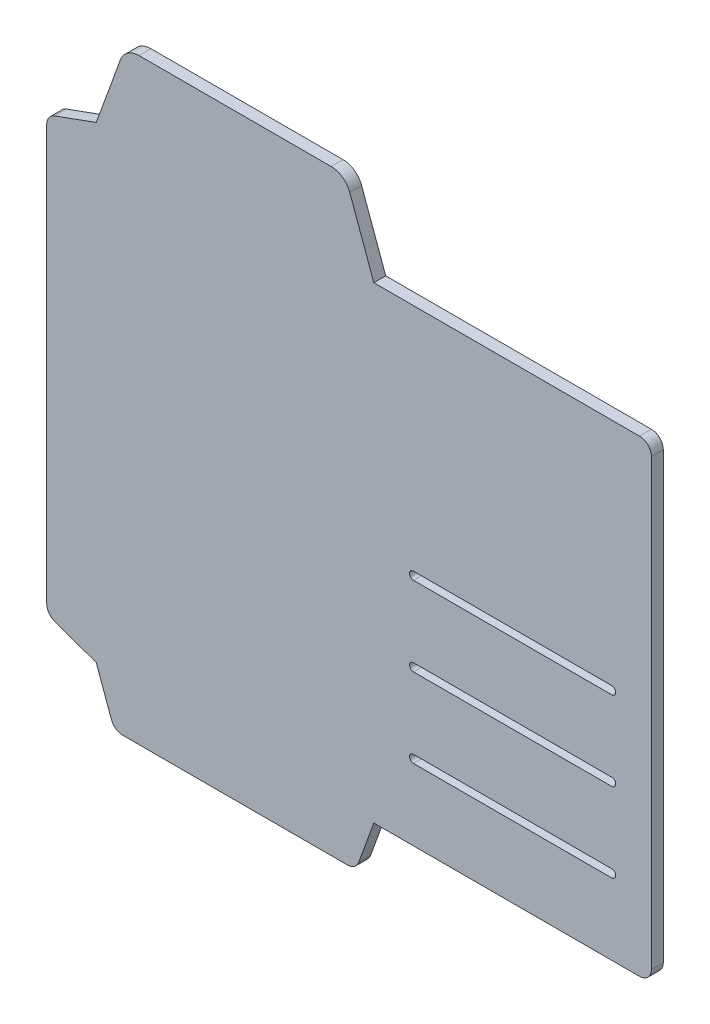
ISO-10303-21;
HEADER;
FILE_DESCRIPTION(('STEP AP214'),'2;1');
FILE_NAME('part.step','',(''),(''),'','','');
FILE_SCHEMA(('AUTOMOTIVE_DESIGN { 1 0 10303 214 1 1 1 1 }'));
ENDSEC;
DATA;
#1=APPLICATION_CONTEXT('core data for automotive mechanical design processes');
#2=APPLICATION_PROTOCOL_DEFINITION('international standard','automotive_design',2000,#1);
#3=PRODUCT_CONTEXT('',#1,'mechanical');
#4=PRODUCT('Part','Part','',(#3));
#5=PRODUCT_RELATED_PRODUCT_CATEGORY('part','',(#4));
#6=PRODUCT_DEFINITION_FORMATION('','',#4);
#7=PRODUCT_DEFINITION_CONTEXT('part definition',#1,'design');
#8=PRODUCT_DEFINITION('design','',#6,#7);
#9=PRODUCT_DEFINITION_SHAPE('','',#8);
#10=(LENGTH_UNIT() NAMED_UNIT(*) SI_UNIT(.MILLI.,.METRE.));
#11=(NAMED_UNIT(*) PLANE_ANGLE_UNIT() SI_UNIT($,.RADIAN.));
#12=(NAMED_UNIT(*) SI_UNIT($,.STERADIAN.) SOLID_ANGLE_UNIT());
#13=UNCERTAINTY_MEASURE_WITH_UNIT(LENGTH_MEASURE(1.E-05),#10,'distance_accuracy_value','');
#14=(GEOMETRIC_REPRESENTATION_CONTEXT(3) GLOBAL_UNCERTAINTY_ASSIGNED_CONTEXT((#13)) GLOBAL_UNIT_ASSIGNED_CONTEXT((#10,
#11,#12)) REPRESENTATION_CONTEXT('',''));
#15=CARTESIAN_POINT('',(0.,0.,0.));
#16=DIRECTION('',(0.,0.,1.));
#17=DIRECTION('',(1.,0.,0.));
#18=AXIS2_PLACEMENT_3D('',#15,#16,#17);
#19=CARTESIAN_POINT('',(0.,0.,3.));
#20=DIRECTION('',(0.,0.,-1.));
#21=DIRECTION('',(-1.,0.,0.));
#22=AXIS2_PLACEMENT_3D('',#19,#20,#21);
#23=PLANE('',#22);
#24=DIRECTION('',(1.,0.,0.));
#25=VECTOR('',#24,1.);
#26=CARTESIAN_POINT('',(80.,58.,3.));
#27=LINE('',#26,#25);
#28=CARTESIAN_POINT('',(80.,58.,3.));
#29=VERTEX_POINT('',#28);
#30=CARTESIAN_POINT('',(130.,58.,3.));
#31=VERTEX_POINT('',#30);
#32=EDGE_CURVE('E265',#29,#31,#27,.T.);
#33=ORIENTED_EDGE('',*,*,#32,.F.);
#34=CARTESIAN_POINT('',(80.,59.,3.));
#35=DIRECTION('',(0.,0.,1.));
#36=DIRECTION('',(1.,0.,0.));
#37=AXIS2_PLACEMENT_3D('',#34,#35,#36);
#38=CIRCLE('',#37,1.);
#39=CARTESIAN_POINT('',(80.,60.,3.));
#40=VERTEX_POINT('',#39);
#41=EDGE_CURVE('E41',#40,#29,#38,.T.);
#42=ORIENTED_EDGE('',*,*,#41,.F.);
#43=DIRECTION('',(-1.,0.,0.));
#44=VECTOR('',#43,1.);
#45=CARTESIAN_POINT('',(80.,60.,3.));
#46=LINE('',#45,#44);
#47=CARTESIAN_POINT('',(130.,60.,3.));
#48=VERTEX_POINT('',#47);
#49=EDGE_CURVE('E83',#48,#40,#46,.T.);
#50=ORIENTED_EDGE('',*,*,#49,.F.);
#51=CARTESIAN_POINT('',(130.,59.,3.));
#52=DIRECTION('',(0.,0.,1.));
#53=DIRECTION('',(1.,0.,0.));
#54=AXIS2_PLACEMENT_3D('',#51,#52,#53);
#55=CIRCLE('',#54,1.);
#56=EDGE_CURVE('E267',#31,#48,#55,.T.);
#57=ORIENTED_EDGE('',*,*,#56,.F.);
#58=EDGE_LOOP('',(#33,#42,#50,#57));
#59=FACE_BOUND('',#58,.T.);
#60=DIRECTION('',(1.,0.,0.));
#61=VECTOR('',#60,1.);
#62=CARTESIAN_POINT('',(80.0000000000002,38.,3.));
#63=LINE('',#62,#61);
#64=CARTESIAN_POINT('',(80.0000000000002,38.,3.));
#65=VERTEX_POINT('',#64);
#66=CARTESIAN_POINT('',(130.,38.,3.));
#67=VERTEX_POINT('',#66);
#68=EDGE_CURVE('E264',#65,#67,#63,.T.);
#69=ORIENTED_EDGE('',*,*,#68,.F.);
#70=CARTESIAN_POINT('',(80.0000000000002,39.,3.));
#71=DIRECTION('',(0.,0.,1.));
#72=DIRECTION('',(1.,0.,0.));
#73=AXIS2_PLACEMENT_3D('',#70,#71,#72);
#74=CIRCLE('',#73,1.);
#75=CARTESIAN_POINT('',(80.0000000000002,40.,3.));
#76=VERTEX_POINT('',#75);
#77=EDGE_CURVE('E253',#76,#65,#74,.T.);
#78=ORIENTED_EDGE('',*,*,#77,.F.);
#79=DIRECTION('',(-1.,0.,0.));
#80=VECTOR('',#79,1.);
#81=CARTESIAN_POINT('',(80.0000000000002,40.,3.));
#82=LINE('',#81,#80);
#83=CARTESIAN_POINT('',(130.,40.,3.));
#84=VERTEX_POINT('',#83);
#85=EDGE_CURVE('E243',#84,#76,#82,.T.);
#86=ORIENTED_EDGE('',*,*,#85,.F.);
#87=CARTESIAN_POINT('',(130.,39.,3.));
#88=DIRECTION('',(0.,0.,1.));
#89=DIRECTION('',(1.,0.,0.));
#90=AXIS2_PLACEMENT_3D('',#87,#88,#89);
#91=CIRCLE('',#90,1.);
#92=EDGE_CURVE('E237',#67,#84,#91,.T.);
#93=ORIENTED_EDGE('',*,*,#92,.F.);
#94=EDGE_LOOP('',(#69,#78,#86,#93));
#95=FACE_BOUND('',#94,.T.);
#96=DIRECTION('',(1.,0.,0.));
#97=VECTOR('',#96,1.);
#98=CARTESIAN_POINT('',(80.0000000000004,18.,3.));
#99=LINE('',#98,#97);
#100=CARTESIAN_POINT('',(80.0000000000004,18.,3.));
#101=VERTEX_POINT('',#100);
#102=CARTESIAN_POINT('',(130.,18.,3.));
#103=VERTEX_POINT('',#102);
#104=EDGE_CURVE('E418',#101,#103,#99,.T.);
#105=ORIENTED_EDGE('',*,*,#104,.F.);
#106=CARTESIAN_POINT('',(80.0000000000004,19.,3.));
#107=DIRECTION('',(0.,0.,1.));
#108=DIRECTION('',(1.,0.,0.));
#109=AXIS2_PLACEMENT_3D('',#106,#107,#108);
#110=CIRCLE('',#109,1.);
#111=CARTESIAN_POINT('',(80.0000000000004,20.,3.));
#112=VERTEX_POINT('',#111);
#113=EDGE_CURVE('E425',#112,#101,#110,.T.);
#114=ORIENTED_EDGE('',*,*,#113,.F.);
#115=DIRECTION('',(-1.,0.,0.));
#116=VECTOR('',#115,1.);
#117=CARTESIAN_POINT('',(80.0000000000004,20.,3.));
#118=LINE('',#117,#116);
#119=CARTESIAN_POINT('',(130.,20.,3.));
#120=VERTEX_POINT('',#119);
#121=EDGE_CURVE('E423',#120,#112,#118,.T.);
#122=ORIENTED_EDGE('',*,*,#121,.F.);
#123=CARTESIAN_POINT('',(130.,19.,3.));
#124=DIRECTION('',(0.,0.,1.));
#125=DIRECTION('',(1.,0.,0.));
#126=AXIS2_PLACEMENT_3D('',#123,#124,#125);
#127=CIRCLE('',#126,1.);
#128=EDGE_CURVE('E420',#103,#120,#127,.T.);
#129=ORIENTED_EDGE('',*,*,#128,.F.);
#130=EDGE_LOOP('',(#105,#114,#122,#129));
#131=FACE_BOUND('',#130,.T.);
#132=DIRECTION('',(1.,0.,0.));
#133=VECTOR('',#132,1.);
#134=CARTESIAN_POINT('',(70.,0.,3.));
#135=LINE('',#134,#133);
#136=CARTESIAN_POINT('',(70.,0.,3.));
#137=VERTEX_POINT('',#136);
#138=CARTESIAN_POINT('',(137.,0.,3.));
#139=VERTEX_POINT('',#138);
#140=EDGE_CURVE('E271',#137,#139,#135,.T.);
#141=ORIENTED_EDGE('',*,*,#140,.T.);
#142=CARTESIAN_POINT('',(137.,3.,3.));
#143=DIRECTION('',(0.,0.,-1.));
#144=DIRECTION('',(-1.,0.,0.));
#145=AXIS2_PLACEMENT_3D('',#142,#143,#144);
#146=CIRCLE('',#145,3.);
#147=CARTESIAN_POINT('',(140.,3.,3.));
#148=VERTEX_POINT('',#147);
#149=EDGE_CURVE('E408',#139,#148,#146,.F.);
#150=ORIENTED_EDGE('',*,*,#149,.T.);
#151=DIRECTION('',(0.,1.,0.));
#152=VECTOR('',#151,1.);
#153=CARTESIAN_POINT('',(140.,0.,3.));
#154=LINE('',#153,#152);
#155=CARTESIAN_POINT('',(140.,115.,3.));
#156=VERTEX_POINT('',#155);
#157=EDGE_CURVE('E276',#148,#156,#154,.T.);
#158=ORIENTED_EDGE('',*,*,#157,.T.);
#159=CARTESIAN_POINT('',(137.,115.,3.));
#160=DIRECTION('',(0.,0.,-1.));
#161=DIRECTION('',(-1.,0.,0.));
#162=AXIS2_PLACEMENT_3D('',#159,#160,#161);
#163=CIRCLE('',#162,3.);
#164=CARTESIAN_POINT('',(137.,118.,3.));
#165=VERTEX_POINT('',#164);
#166=EDGE_CURVE('E406',#156,#165,#163,.F.);
#167=ORIENTED_EDGE('',*,*,#166,.T.);
#168=DIRECTION('',(-1.,0.,0.));
#169=VECTOR('',#168,1.);
#170=CARTESIAN_POINT('',(70.,118.,3.));
#171=LINE('',#170,#169);
#172=CARTESIAN_POINT('',(70.,118.,3.));
#173=VERTEX_POINT('',#172);
#174=EDGE_CURVE('E281',#165,#173,#171,.T.);
#175=ORIENTED_EDGE('',*,*,#174,.T.);
#176=DIRECTION('',(-0.342020143325666,0.939692620785909,0.));
#177=VECTOR('',#176,1.);
#178=CARTESIAN_POINT('',(99.7360244806699,36.3009441950088,3.));
#179=LINE('',#178,#177);
#180=CARTESIAN_POINT('',(63.918020727557,134.710100716628,3.));
#181=VERTEX_POINT('',#180);
#182=EDGE_CURVE('E334',#173,#181,#179,.T.);
#183=ORIENTED_EDGE('',*,*,#182,.T.);
#184=CARTESIAN_POINT('',(59.2195576236275,133.,3.));
#185=DIRECTION('',(0.,0.,-1.));
#186=DIRECTION('',(-1.,0.,0.));
#187=AXIS2_PLACEMENT_3D('',#184,#185,#186);
#188=CIRCLE('',#187,5.);
#189=CARTESIAN_POINT('',(59.2195576236275,138.,3.));
#190=VERTEX_POINT('',#189);
#191=EDGE_CURVE('E390',#181,#190,#188,.F.);
#192=ORIENTED_EDGE('',*,*,#191,.T.);
#193=DIRECTION('',(-1.,0.,0.));
#194=VECTOR('',#193,1.);
#195=CARTESIAN_POINT('',(0.,138.,3.));
#196=LINE('',#195,#194);
#197=CARTESIAN_POINT('',(10.7804423763725,138.,3.));
#198=VERTEX_POINT('',#197);
#199=EDGE_CURVE('E325',#190,#198,#196,.T.);
#200=ORIENTED_EDGE('',*,*,#199,.T.);
#201=CARTESIAN_POINT('',(10.7804423763725,133.,3.));
#202=DIRECTION('',(0.,0.,-1.));
#203=DIRECTION('',(-1.,0.,0.));
#204=AXIS2_PLACEMENT_3D('',#201,#202,#203);
#205=CIRCLE('',#204,5.);
#206=CARTESIAN_POINT('',(6.081979272443,134.710100716628,3.));
#207=VERTEX_POINT('',#206);
#208=EDGE_CURVE('E392',#198,#207,#205,.F.);
#209=ORIENTED_EDGE('',*,*,#208,.T.);
#210=DIRECTION('',(0.342020143325666,0.939692620785909,0.));
#211=VECTOR('',#210,1.);
#212=CARTESIAN_POINT('',(-37.9244689715056,13.8033778559801,3.));
#213=LINE('',#212,#211);
#214=CARTESIAN_POINT('',(0.,118.,3.));
#215=VERTEX_POINT('',#214);
#216=EDGE_CURVE('E312',#215,#207,#213,.T.);
#217=ORIENTED_EDGE('',*,*,#216,.F.);
#218=DIRECTION('',(-0.939692620785907,-0.342020143325673,0.));
#219=VECTOR('',#218,1.);
#220=CARTESIAN_POINT('',(-37.9244689715062,104.196622144019,3.));
#221=LINE('',#220,#219);
#222=CARTESIAN_POINT('',(-10.526060429977,114.168827319401,3.));
#223=VERTEX_POINT('',#222);
#224=EDGE_CURVE('E309',#215,#223,#221,.T.);
#225=ORIENTED_EDGE('',*,*,#224,.T.);
#226=CARTESIAN_POINT('',(-9.49999999999998,111.349749457043,3.));
#227=DIRECTION('',(0.,0.,-1.));
#228=DIRECTION('',(-1.,0.,0.));
#229=AXIS2_PLACEMENT_3D('',#226,#227,#228);
#230=CIRCLE('',#229,3.);
#231=CARTESIAN_POINT('',(-12.5,111.349749457043,3.));
#232=VERTEX_POINT('',#231);
#233=EDGE_CURVE('E354',#223,#232,#230,.F.);
#234=ORIENTED_EDGE('',*,*,#233,.T.);
#235=DIRECTION('',(0.,1.,0.));
#236=VECTOR('',#235,1.);
#237=CARTESIAN_POINT('',(-12.5,0.,3.));
#238=LINE('',#237,#236);
#239=CARTESIAN_POINT('',(-12.5,6.6502505429567,3.));
#240=VERTEX_POINT('',#239);
#241=EDGE_CURVE('E305',#240,#232,#238,.T.);
#242=ORIENTED_EDGE('',*,*,#241,.F.);
#243=CARTESIAN_POINT('',(-9.49999999999998,6.6502505429567,3.));
#244=DIRECTION('',(0.,0.,-1.));
#245=DIRECTION('',(-1.,0.,0.));
#246=AXIS2_PLACEMENT_3D('',#243,#244,#245);
#247=CIRCLE('',#246,3.);
#248=CARTESIAN_POINT('',(-10.526060429977,3.83117268059898,3.));
#249=VERTEX_POINT('',#248);
#250=EDGE_CURVE('E356',#240,#249,#247,.F.);
#251=ORIENTED_EDGE('',*,*,#250,.T.);
#252=DIRECTION('',(-0.939692620785907,0.342020143325672,0.));
#253=VECTOR('',#252,1.);
#254=CARTESIAN_POINT('',(0.,0.,3.));
#255=LINE('',#254,#253);
#256=CARTESIAN_POINT('',(0.,0.,3.));
#257=VERTEX_POINT('',#256);
#258=EDGE_CURVE('E294',#257,#249,#255,.T.);
#259=ORIENTED_EDGE('',*,*,#258,.F.);
#260=DIRECTION('',(-0.342020143325673,0.939692620785907,0.));
#261=VECTOR('',#260,1.);
#262=CARTESIAN_POINT('',(0.,0.,3.));
#263=LINE('',#262,#261);
#264=CARTESIAN_POINT('',(3.83117268059899,-10.526060429977,3.));
#265=VERTEX_POINT('',#264);
#266=EDGE_CURVE('E289',#265,#257,#263,.T.);
#267=ORIENTED_EDGE('',*,*,#266,.F.);
#268=CARTESIAN_POINT('',(6.65025054295671,-9.49999999999999,3.));
#269=DIRECTION('',(0.,0.,-1.));
#270=DIRECTION('',(-1.,0.,0.));
#271=AXIS2_PLACEMENT_3D('',#268,#269,#270);
#272=CIRCLE('',#271,3.);
#273=CARTESIAN_POINT('',(6.65025054295671,-12.5,3.));
#274=VERTEX_POINT('',#273);
#275=EDGE_CURVE('E372',#265,#274,#272,.F.);
#276=ORIENTED_EDGE('',*,*,#275,.T.);
#277=DIRECTION('',(-1.,0.,0.));
#278=VECTOR('',#277,1.);
#279=CARTESIAN_POINT('',(0.,-12.5,3.));
#280=LINE('',#279,#278);
#281=CARTESIAN_POINT('',(63.3497494570433,-12.5,3.));
#282=VERTEX_POINT('',#281);
#283=EDGE_CURVE('E291',#282,#274,#280,.T.);
#284=ORIENTED_EDGE('',*,*,#283,.F.);
#285=CARTESIAN_POINT('',(63.3497494570433,-9.49999999999999,3.));
#286=DIRECTION('',(0.,0.,-1.));
#287=DIRECTION('',(-1.,0.,0.));
#288=AXIS2_PLACEMENT_3D('',#285,#286,#287);
#289=CIRCLE('',#288,3.);
#290=CARTESIAN_POINT('',(66.168827319401,-10.526060429977,3.));
#291=VERTEX_POINT('',#290);
#292=EDGE_CURVE('E374',#282,#291,#289,.F.);
#293=ORIENTED_EDGE('',*,*,#292,.T.);
#294=DIRECTION('',(0.342020143325671,0.939692620785908,0.));
#295=VECTOR('',#294,1.);
#296=CARTESIAN_POINT('',(61.8115555091641,-22.497566339029,3.));
#297=LINE('',#296,#295);
#298=EDGE_CURVE('E292',#291,#137,#297,.T.);
#299=ORIENTED_EDGE('',*,*,#298,.T.);
#300=EDGE_LOOP('',(#141,#150,#158,#167,#175,#183,#192,#200,#209,#217,#225,#234,#242,#251,#259,
#267,#276,#284,#293,#299));
#301=FACE_BOUND('',#300,.T.);
#302=ADVANCED_FACE('F37',(#59,#95,#131,#301),#23,.F.);
#303=CARTESIAN_POINT('',(0.,0.,0.));
#304=DIRECTION('',(0.,0.,-1.));
#305=DIRECTION('',(-1.,0.,0.));
#306=AXIS2_PLACEMENT_3D('',#303,#304,#305);
#307=PLANE('',#306);
#308=CARTESIAN_POINT('',(80.,59.,0.));
#309=DIRECTION('',(0.,0.,1.));
#310=DIRECTION('',(1.,0.,0.));
#311=AXIS2_PLACEMENT_3D('',#308,#309,#310);
#312=CIRCLE('',#311,1.);
#313=CARTESIAN_POINT('',(80.,60.,0.));
#314=VERTEX_POINT('',#313);
#315=CARTESIAN_POINT('',(80.,58.,0.));
#316=VERTEX_POINT('',#315);
#317=EDGE_CURVE('E261',#314,#316,#312,.T.);
#318=ORIENTED_EDGE('',*,*,#317,.T.);
#319=DIRECTION('',(1.,0.,0.));
#320=VECTOR('',#319,1.);
#321=CARTESIAN_POINT('',(80.,58.,0.));
#322=LINE('',#321,#320);
#323=CARTESIAN_POINT('',(130.,58.,0.));
#324=VERTEX_POINT('',#323);
#325=EDGE_CURVE('E793',#316,#324,#322,.T.);
#326=ORIENTED_EDGE('',*,*,#325,.T.);
#327=CARTESIAN_POINT('',(130.,59.,0.));
#328=DIRECTION('',(0.,0.,1.));
#329=DIRECTION('',(1.,0.,0.));
#330=AXIS2_PLACEMENT_3D('',#327,#328,#329);
#331=CIRCLE('',#330,1.);
#332=CARTESIAN_POINT('',(130.,60.,0.));
#333=VERTEX_POINT('',#332);
#334=EDGE_CURVE('E802',#324,#333,#331,.T.);
#335=ORIENTED_EDGE('',*,*,#334,.T.);
#336=DIRECTION('',(-1.,0.,0.));
#337=VECTOR('',#336,1.);
#338=CARTESIAN_POINT('',(80.,60.,0.));
#339=LINE('',#338,#337);
#340=EDGE_CURVE('E805',#333,#314,#339,.T.);
#341=ORIENTED_EDGE('',*,*,#340,.T.);
#342=EDGE_LOOP('',(#318,#326,#335,#341));
#343=FACE_BOUND('',#342,.T.);
#344=CARTESIAN_POINT('',(80.0000000000002,39.,0.));
#345=DIRECTION('',(0.,0.,1.));
#346=DIRECTION('',(1.,0.,0.));
#347=AXIS2_PLACEMENT_3D('',#344,#345,#346);
#348=CIRCLE('',#347,1.);
#349=CARTESIAN_POINT('',(80.0000000000002,40.,0.));
#350=VERTEX_POINT('',#349);
#351=CARTESIAN_POINT('',(80.0000000000002,38.,0.));
#352=VERTEX_POINT('',#351);
#353=EDGE_CURVE('E259',#350,#352,#348,.T.);
#354=ORIENTED_EDGE('',*,*,#353,.T.);
#355=DIRECTION('',(1.,0.,0.));
#356=VECTOR('',#355,1.);
#357=CARTESIAN_POINT('',(80.0000000000002,38.,0.));
#358=LINE('',#357,#356);
#359=CARTESIAN_POINT('',(130.,38.,0.));
#360=VERTEX_POINT('',#359);
#361=EDGE_CURVE('E814',#352,#360,#358,.T.);
#362=ORIENTED_EDGE('',*,*,#361,.T.);
#363=CARTESIAN_POINT('',(130.,39.,0.));
#364=DIRECTION('',(0.,0.,1.));
#365=DIRECTION('',(1.,0.,0.));
#366=AXIS2_PLACEMENT_3D('',#363,#364,#365);
#367=CIRCLE('',#366,1.);
#368=CARTESIAN_POINT('',(130.,40.,0.));
#369=VERTEX_POINT('',#368);
#370=EDGE_CURVE('E434',#360,#369,#367,.T.);
#371=ORIENTED_EDGE('',*,*,#370,.T.);
#372=DIRECTION('',(-1.,0.,0.));
#373=VECTOR('',#372,1.);
#374=CARTESIAN_POINT('',(80.0000000000002,40.,0.));
#375=LINE('',#374,#373);
#376=EDGE_CURVE('E437',#369,#350,#375,.T.);
#377=ORIENTED_EDGE('',*,*,#376,.T.);
#378=EDGE_LOOP('',(#354,#362,#371,#377));
#379=FACE_BOUND('',#378,.T.);
#380=CARTESIAN_POINT('',(80.0000000000004,19.,0.));
#381=DIRECTION('',(0.,0.,1.));
#382=DIRECTION('',(1.,0.,0.));
#383=AXIS2_PLACEMENT_3D('',#380,#381,#382);
#384=CIRCLE('',#383,1.);
#385=CARTESIAN_POINT('',(80.0000000000004,20.,0.));
#386=VERTEX_POINT('',#385);
#387=CARTESIAN_POINT('',(80.0000000000004,18.,0.));
#388=VERTEX_POINT('',#387);
#389=EDGE_CURVE('E440',#386,#388,#384,.T.);
#390=ORIENTED_EDGE('',*,*,#389,.T.);
#391=DIRECTION('',(1.,0.,0.));
#392=VECTOR('',#391,1.);
#393=CARTESIAN_POINT('',(80.0000000000004,18.,0.));
#394=LINE('',#393,#392);
#395=CARTESIAN_POINT('',(130.,18.,0.));
#396=VERTEX_POINT('',#395);
#397=EDGE_CURVE('E443',#388,#396,#394,.T.);
#398=ORIENTED_EDGE('',*,*,#397,.T.);
#399=CARTESIAN_POINT('',(130.,19.,0.));
#400=DIRECTION('',(0.,0.,1.));
#401=DIRECTION('',(1.,0.,0.));
#402=AXIS2_PLACEMENT_3D('',#399,#400,#401);
#403=CIRCLE('',#402,1.);
#404=CARTESIAN_POINT('',(130.,20.,0.));
#405=VERTEX_POINT('',#404);
#406=EDGE_CURVE('E446',#396,#405,#403,.T.);
#407=ORIENTED_EDGE('',*,*,#406,.T.);
#408=DIRECTION('',(-1.,0.,0.));
#409=VECTOR('',#408,1.);
#410=CARTESIAN_POINT('',(80.0000000000004,20.,0.));
#411=LINE('',#410,#409);
#412=EDGE_CURVE('E449',#405,#386,#411,.T.);
#413=ORIENTED_EDGE('',*,*,#412,.T.);
#414=EDGE_LOOP('',(#390,#398,#407,#413));
#415=FACE_BOUND('',#414,.T.);
#416=DIRECTION('',(0.,1.,0.));
#417=VECTOR('',#416,1.);
#418=CARTESIAN_POINT('',(140.,0.,0.));
#419=LINE('',#418,#417);
#420=CARTESIAN_POINT('',(140.,3.,0.));
#421=VERTEX_POINT('',#420);
#422=CARTESIAN_POINT('',(140.,115.,0.));
#423=VERTEX_POINT('',#422);
#424=EDGE_CURVE('E464',#421,#423,#419,.T.);
#425=ORIENTED_EDGE('',*,*,#424,.F.);
#426=CARTESIAN_POINT('',(137.,3.,0.));
#427=DIRECTION('',(0.,0.,-1.));
#428=DIRECTION('',(-1.,0.,0.));
#429=AXIS2_PLACEMENT_3D('',#426,#427,#428);
#430=CIRCLE('',#429,3.);
#431=CARTESIAN_POINT('',(137.,0.,0.));
#432=VERTEX_POINT('',#431);
#433=EDGE_CURVE('E46',#421,#432,#430,.T.);
#434=ORIENTED_EDGE('',*,*,#433,.T.);
#435=DIRECTION('',(1.,0.,0.));
#436=VECTOR('',#435,1.);
#437=CARTESIAN_POINT('',(70.,0.,0.));
#438=LINE('',#437,#436);
#439=CARTESIAN_POINT('',(70.,0.,0.));
#440=VERTEX_POINT('',#439);
#441=EDGE_CURVE('E288',#440,#432,#438,.T.);
#442=ORIENTED_EDGE('',*,*,#441,.F.);
#443=DIRECTION('',(0.342020143325671,0.939692620785908,0.));
#444=VECTOR('',#443,1.);
#445=CARTESIAN_POINT('',(61.8115555091641,-22.497566339029,0.));
#446=LINE('',#445,#444);
#447=CARTESIAN_POINT('',(66.168827319401,-10.526060429977,0.));
#448=VERTEX_POINT('',#447);
#449=EDGE_CURVE('E92',#448,#440,#446,.T.);
#450=ORIENTED_EDGE('',*,*,#449,.F.);
#451=CARTESIAN_POINT('',(63.3497494570433,-9.49999999999999,0.));
#452=DIRECTION('',(0.,0.,-1.));
#453=DIRECTION('',(-1.,0.,0.));
#454=AXIS2_PLACEMENT_3D('',#451,#452,#453);
#455=CIRCLE('',#454,3.);
#456=CARTESIAN_POINT('',(63.3497494570433,-12.5,0.));
#457=VERTEX_POINT('',#456);
#458=EDGE_CURVE('E380',#448,#457,#455,.T.);
#459=ORIENTED_EDGE('',*,*,#458,.T.);
#460=DIRECTION('',(-1.,0.,0.));
#461=VECTOR('',#460,1.);
#462=CARTESIAN_POINT('',(0.,-12.5,0.));
#463=LINE('',#462,#461);
#464=CARTESIAN_POINT('',(6.65025054295671,-12.5,0.));
#465=VERTEX_POINT('',#464);
#466=EDGE_CURVE('E299',#457,#465,#463,.T.);
#467=ORIENTED_EDGE('',*,*,#466,.T.);
#468=CARTESIAN_POINT('',(6.65025054295671,-9.49999999999999,0.));
#469=DIRECTION('',(0.,0.,-1.));
#470=DIRECTION('',(-1.,0.,0.));
#471=AXIS2_PLACEMENT_3D('',#468,#469,#470);
#472=CIRCLE('',#471,3.);
#473=CARTESIAN_POINT('',(3.83117268059899,-10.526060429977,0.));
#474=VERTEX_POINT('',#473);
#475=EDGE_CURVE('E378',#465,#474,#472,.T.);
#476=ORIENTED_EDGE('',*,*,#475,.T.);
#477=DIRECTION('',(-0.342020143325673,0.939692620785907,0.));
#478=VECTOR('',#477,1.);
#479=CARTESIAN_POINT('',(0.,0.,0.));
#480=LINE('',#479,#478);
#481=CARTESIAN_POINT('',(0.,0.,0.));
#482=VERTEX_POINT('',#481);
#483=EDGE_CURVE('E295',#474,#482,#480,.T.);
#484=ORIENTED_EDGE('',*,*,#483,.T.);
#485=DIRECTION('',(-0.939692620785907,0.342020143325672,0.));
#486=VECTOR('',#485,1.);
#487=CARTESIAN_POINT('',(0.,0.,0.));
#488=LINE('',#487,#486);
#489=CARTESIAN_POINT('',(-10.526060429977,3.83117268059898,0.));
#490=VERTEX_POINT('',#489);
#491=EDGE_CURVE('E314',#482,#490,#488,.T.);
#492=ORIENTED_EDGE('',*,*,#491,.T.);
#493=CARTESIAN_POINT('',(-9.49999999999998,6.6502505429567,0.));
#494=DIRECTION('',(0.,0.,-1.));
#495=DIRECTION('',(-1.,0.,0.));
#496=AXIS2_PLACEMENT_3D('',#493,#494,#495);
#497=CIRCLE('',#496,3.);
#498=CARTESIAN_POINT('',(-12.5,6.6502505429567,0.));
#499=VERTEX_POINT('',#498);
#500=EDGE_CURVE('E362',#490,#499,#497,.T.);
#501=ORIENTED_EDGE('',*,*,#500,.T.);
#502=DIRECTION('',(0.,1.,0.));
#503=VECTOR('',#502,1.);
#504=CARTESIAN_POINT('',(-12.5,0.,0.));
#505=LINE('',#504,#503);
#506=CARTESIAN_POINT('',(-12.5,111.349749457043,0.));
#507=VERTEX_POINT('',#506);
#508=EDGE_CURVE('E313',#499,#507,#505,.T.);
#509=ORIENTED_EDGE('',*,*,#508,.T.);
#510=CARTESIAN_POINT('',(-9.49999999999998,111.349749457043,0.));
#511=DIRECTION('',(0.,0.,-1.));
#512=DIRECTION('',(-1.,0.,0.));
#513=AXIS2_PLACEMENT_3D('',#510,#511,#512);
#514=CIRCLE('',#513,3.);
#515=CARTESIAN_POINT('',(-10.526060429977,114.168827319401,0.));
#516=VERTEX_POINT('',#515);
#517=EDGE_CURVE('E360',#507,#516,#514,.T.);
#518=ORIENTED_EDGE('',*,*,#517,.T.);
#519=DIRECTION('',(-0.939692620785907,-0.342020143325673,0.));
#520=VECTOR('',#519,1.);
#521=CARTESIAN_POINT('',(-37.9244689715062,104.196622144019,0.));
#522=LINE('',#521,#520);
#523=CARTESIAN_POINT('',(0.,118.,0.));
#524=VERTEX_POINT('',#523);
#525=EDGE_CURVE('E308',#524,#516,#522,.T.);
#526=ORIENTED_EDGE('',*,*,#525,.F.);
#527=DIRECTION('',(0.342020143325666,0.939692620785909,0.));
#528=VECTOR('',#527,1.);
#529=CARTESIAN_POINT('',(-37.9244689715056,13.8033778559801,0.));
#530=LINE('',#529,#528);
#531=CARTESIAN_POINT('',(6.081979272443,134.710100716628,0.));
#532=VERTEX_POINT('',#531);
#533=EDGE_CURVE('E321',#524,#532,#530,.T.);
#534=ORIENTED_EDGE('',*,*,#533,.T.);
#535=CARTESIAN_POINT('',(10.7804423763725,133.,0.));
#536=DIRECTION('',(0.,0.,-1.));
#537=DIRECTION('',(-1.,0.,0.));
#538=AXIS2_PLACEMENT_3D('',#535,#536,#537);
#539=CIRCLE('',#538,5.);
#540=CARTESIAN_POINT('',(10.7804423763725,138.,0.));
#541=VERTEX_POINT('',#540);
#542=EDGE_CURVE('E398',#532,#541,#539,.T.);
#543=ORIENTED_EDGE('',*,*,#542,.T.);
#544=DIRECTION('',(-1.,0.,0.));
#545=VECTOR('',#544,1.);
#546=CARTESIAN_POINT('',(0.,138.,0.));
#547=LINE('',#546,#545);
#548=CARTESIAN_POINT('',(59.2195576236275,138.,0.));
#549=VERTEX_POINT('',#548);
#550=EDGE_CURVE('E328',#549,#541,#547,.T.);
#551=ORIENTED_EDGE('',*,*,#550,.F.);
#552=CARTESIAN_POINT('',(59.2195576236275,133.,0.));
#553=DIRECTION('',(0.,0.,-1.));
#554=DIRECTION('',(-1.,0.,0.));
#555=AXIS2_PLACEMENT_3D('',#552,#553,#554);
#556=CIRCLE('',#555,5.);
#557=CARTESIAN_POINT('',(63.918020727557,134.710100716628,0.));
#558=VERTEX_POINT('',#557);
#559=EDGE_CURVE('E396',#549,#558,#556,.T.);
#560=ORIENTED_EDGE('',*,*,#559,.T.);
#561=DIRECTION('',(-0.342020143325666,0.939692620785909,0.));
#562=VECTOR('',#561,1.);
#563=CARTESIAN_POINT('',(99.7360244806699,36.3009441950088,0.));
#564=LINE('',#563,#562);
#565=CARTESIAN_POINT('',(70.,118.,0.));
#566=VERTEX_POINT('',#565);
#567=EDGE_CURVE('E324',#566,#558,#564,.T.);
#568=ORIENTED_EDGE('',*,*,#567,.F.);
#569=DIRECTION('',(-1.,0.,0.));
#570=VECTOR('',#569,1.);
#571=CARTESIAN_POINT('',(70.,118.,0.));
#572=LINE('',#571,#570);
#573=CARTESIAN_POINT('',(137.,118.,0.));
#574=VERTEX_POINT('',#573);
#575=EDGE_CURVE('E284',#574,#566,#572,.T.);
#576=ORIENTED_EDGE('',*,*,#575,.F.);
#577=CARTESIAN_POINT('',(137.,115.,0.));
#578=DIRECTION('',(0.,0.,-1.));
#579=DIRECTION('',(-1.,0.,0.));
#580=AXIS2_PLACEMENT_3D('',#577,#578,#579);
#581=CIRCLE('',#580,3.);
#582=EDGE_CURVE('E415',#574,#423,#581,.T.);
#583=ORIENTED_EDGE('',*,*,#582,.T.);
#584=EDGE_LOOP('',(#425,#434,#442,#450,#459,#467,#476,#484,#492,#501,#509,#518,#526,#534,#543,
#551,#560,#568,#576,#583));
#585=FACE_BOUND('',#584,.T.);
#586=ADVANCED_FACE('F482',(#343,#379,#415,#585),#307,.T.);
#587=CARTESIAN_POINT('',(-37.9244689715056,13.8033778559801,0.));
#588=DIRECTION('',(0.939692620785909,-0.342020143325666,0.));
#589=DIRECTION('',(0.342020143325666,0.939692620785909,0.));
#590=AXIS2_PLACEMENT_3D('',#587,#588,#589);
#591=PLANE('',#590);
#592=ORIENTED_EDGE('',*,*,#216,.T.);
#593=DIRECTION('',(0.,0.,1.));
#594=VECTOR('',#593,1.);
#595=CARTESIAN_POINT('',(6.08197927244299,134.710100716628,0.));
#596=LINE('',#595,#594);
#597=EDGE_CURVE('E394',#207,#532,#596,.F.);
#598=ORIENTED_EDGE('',*,*,#597,.T.);
#599=ORIENTED_EDGE('',*,*,#533,.F.);
#600=DIRECTION('',(0.,0.,-1.));
#601=VECTOR('',#600,1.);
#602=CARTESIAN_POINT('',(0.,118.,3.));
#603=LINE('',#602,#601);
#604=EDGE_CURVE('E331',#215,#524,#603,.T.);
#605=ORIENTED_EDGE('',*,*,#604,.F.);
#606=EDGE_LOOP('',(#592,#598,#599,#605));
#607=FACE_BOUND('',#606,.T.);
#608=ADVANCED_FACE('F542',(#607),#591,.F.);
#609=CARTESIAN_POINT('',(0.,138.,0.));
#610=DIRECTION('',(0.,1.,0.));
#611=DIRECTION('',(0.,0.,1.));
#612=AXIS2_PLACEMENT_3D('',#609,#610,#611);
#613=PLANE('',#612);
#614=ORIENTED_EDGE('',*,*,#550,.T.);
#615=DIRECTION('',(0.,0.,1.));
#616=VECTOR('',#615,1.);
#617=CARTESIAN_POINT('',(10.7804423763725,138.,3.));
#618=LINE('',#617,#616);
#619=EDGE_CURVE('E387',#541,#198,#618,.T.);
#620=ORIENTED_EDGE('',*,*,#619,.T.);
#621=ORIENTED_EDGE('',*,*,#199,.F.);
#622=DIRECTION('',(0.,0.,1.));
#623=VECTOR('',#622,1.);
#624=CARTESIAN_POINT('',(59.2195576236275,138.,0.));
#625=LINE('',#624,#623);
#626=EDGE_CURVE('E385',#190,#549,#625,.F.);
#627=ORIENTED_EDGE('',*,*,#626,.T.);
#628=EDGE_LOOP('',(#614,#620,#621,#627));
#629=FACE_BOUND('',#628,.T.);
#630=ADVANCED_FACE('F549',(#629),#613,.T.);
#631=CARTESIAN_POINT('',(99.7360244806699,36.3009441950088,0.));
#632=DIRECTION('',(0.939692620785909,0.342020143325666,0.));
#633=DIRECTION('',(-0.342020143325666,0.939692620785909,0.));
#634=AXIS2_PLACEMENT_3D('',#631,#632,#633);
#635=PLANE('',#634);
#636=ORIENTED_EDGE('',*,*,#567,.T.);
#637=DIRECTION('',(0.,0.,1.));
#638=VECTOR('',#637,1.);
#639=CARTESIAN_POINT('',(63.918020727557,134.710100716628,0.));
#640=LINE('',#639,#638);
#641=EDGE_CURVE('E400',#558,#181,#640,.T.);
#642=ORIENTED_EDGE('',*,*,#641,.T.);
#643=ORIENTED_EDGE('',*,*,#182,.F.);
#644=DIRECTION('',(0.,0.,-1.));
#645=VECTOR('',#644,1.);
#646=CARTESIAN_POINT('',(70.,118.,3.));
#647=LINE('',#646,#645);
#648=EDGE_CURVE('E341',#173,#566,#647,.T.);
#649=ORIENTED_EDGE('',*,*,#648,.T.);
#650=EDGE_LOOP('',(#636,#642,#643,#649));
#651=FACE_BOUND('',#650,.T.);
#652=ADVANCED_FACE('F480',(#651),#635,.T.);
#653=CARTESIAN_POINT('',(0.,0.,0.));
#654=DIRECTION('',(0.342020143325672,0.939692620785907,0.));
#655=DIRECTION('',(-0.939692620785907,0.342020143325672,0.));
#656=AXIS2_PLACEMENT_3D('',#653,#654,#655);
#657=PLANE('',#656);
#658=ORIENTED_EDGE('',*,*,#258,.T.);
#659=DIRECTION('',(0.,0.,1.));
#660=VECTOR('',#659,1.);
#661=CARTESIAN_POINT('',(-10.526060429977,3.83117268059898,0.));
#662=LINE('',#661,#660);
#663=EDGE_CURVE('E358',#249,#490,#662,.F.);
#664=ORIENTED_EDGE('',*,*,#663,.T.);
#665=ORIENTED_EDGE('',*,*,#491,.F.);
#666=DIRECTION('',(0.,0.,-1.));
#667=VECTOR('',#666,1.);
#668=CARTESIAN_POINT('',(0.,0.,3.));
#669=LINE('',#668,#667);
#670=EDGE_CURVE('E346',#257,#482,#669,.T.);
#671=ORIENTED_EDGE('',*,*,#670,.F.);
#672=EDGE_LOOP('',(#658,#664,#665,#671));
#673=FACE_BOUND('',#672,.T.);
#674=ADVANCED_FACE('F522',(#673),#657,.F.);
#675=CARTESIAN_POINT('',(-12.5,0.,0.));
#676=DIRECTION('',(1.,0.,0.));
#677=DIRECTION('',(0.,1.,0.));
#678=AXIS2_PLACEMENT_3D('',#675,#676,#677);
#679=PLANE('',#678);
#680=ORIENTED_EDGE('',*,*,#508,.F.);
#681=DIRECTION('',(0.,0.,1.));
#682=VECTOR('',#681,1.);
#683=CARTESIAN_POINT('',(-12.5,6.6502505429567,0.));
#684=LINE('',#683,#682);
#685=EDGE_CURVE('E351',#499,#240,#684,.T.);
#686=ORIENTED_EDGE('',*,*,#685,.T.);
#687=ORIENTED_EDGE('',*,*,#241,.T.);
#688=DIRECTION('',(0.,0.,1.));
#689=VECTOR('',#688,1.);
#690=CARTESIAN_POINT('',(-12.5,111.349749457043,0.));
#691=LINE('',#690,#689);
#692=EDGE_CURVE('E349',#232,#507,#691,.F.);
#693=ORIENTED_EDGE('',*,*,#692,.T.);
#694=EDGE_LOOP('',(#680,#686,#687,#693));
#695=FACE_BOUND('',#694,.T.);
#696=ADVANCED_FACE('F530',(#695),#679,.F.);
#697=CARTESIAN_POINT('',(-37.9244689715062,104.196622144019,0.));
#698=DIRECTION('',(-0.342020143325673,0.939692620785907,0.));
#699=DIRECTION('',(-0.939692620785907,-0.342020143325673,0.));
#700=AXIS2_PLACEMENT_3D('',#697,#698,#699);
#701=PLANE('',#700);
#702=ORIENTED_EDGE('',*,*,#525,.T.);
#703=DIRECTION('',(0.,0.,1.));
#704=VECTOR('',#703,1.);
#705=CARTESIAN_POINT('',(-10.526060429977,114.168827319401,3.));
#706=LINE('',#705,#704);
#707=EDGE_CURVE('E364',#516,#223,#706,.T.);
#708=ORIENTED_EDGE('',*,*,#707,.T.);
#709=ORIENTED_EDGE('',*,*,#224,.F.);
#710=ORIENTED_EDGE('',*,*,#604,.T.);
#711=EDGE_LOOP('',(#702,#708,#709,#710));
#712=FACE_BOUND('',#711,.T.);
#713=ADVANCED_FACE('F538',(#712),#701,.T.);
#714=CARTESIAN_POINT('',(0.,-12.5,0.));
#715=DIRECTION('',(0.,1.,0.));
#716=DIRECTION('',(-1.,0.,0.));
#717=AXIS2_PLACEMENT_3D('',#714,#715,#716);
#718=PLANE('',#717);
#719=ORIENTED_EDGE('',*,*,#466,.F.);
#720=DIRECTION('',(0.,0.,1.));
#721=VECTOR('',#720,1.);
#722=CARTESIAN_POINT('',(63.3497494570433,-12.5,3.));
#723=LINE('',#722,#721);
#724=EDGE_CURVE('E369',#457,#282,#723,.T.);
#725=ORIENTED_EDGE('',*,*,#724,.T.);
#726=ORIENTED_EDGE('',*,*,#283,.T.);
#727=DIRECTION('',(0.,0.,1.));
#728=VECTOR('',#727,1.);
#729=CARTESIAN_POINT('',(6.65025054295671,-12.5,0.));
#730=LINE('',#729,#728);
#731=EDGE_CURVE('E367',#274,#465,#730,.F.);
#732=ORIENTED_EDGE('',*,*,#731,.T.);
#733=EDGE_LOOP('',(#719,#725,#726,#732));
#734=FACE_BOUND('',#733,.T.);
#735=ADVANCED_FACE('F506',(#734),#718,.F.);
#736=CARTESIAN_POINT('',(0.,0.,0.));
#737=DIRECTION('',(0.939692620785907,0.342020143325673,0.));
#738=DIRECTION('',(-0.342020143325673,0.939692620785907,0.));
#739=AXIS2_PLACEMENT_3D('',#736,#737,#738);
#740=PLANE('',#739);
#741=ORIENTED_EDGE('',*,*,#483,.F.);
#742=DIRECTION('',(0.,0.,1.));
#743=VECTOR('',#742,1.);
#744=CARTESIAN_POINT('',(3.83117268059899,-10.526060429977,0.));
#745=LINE('',#744,#743);
#746=EDGE_CURVE('E382',#474,#265,#745,.T.);
#747=ORIENTED_EDGE('',*,*,#746,.T.);
#748=ORIENTED_EDGE('',*,*,#266,.T.);
#749=ORIENTED_EDGE('',*,*,#670,.T.);
#750=EDGE_LOOP('',(#741,#747,#748,#749));
#751=FACE_BOUND('',#750,.T.);
#752=ADVANCED_FACE('F517',(#751),#740,.F.);
#753=CARTESIAN_POINT('',(61.8115555091641,-22.497566339029,0.));
#754=DIRECTION('',(0.939692620785908,-0.342020143325671,0.));
#755=DIRECTION('',(0.342020143325671,0.939692620785908,0.));
#756=AXIS2_PLACEMENT_3D('',#753,#754,#755);
#757=PLANE('',#756);
#758=ORIENTED_EDGE('',*,*,#298,.F.);
#759=DIRECTION('',(0.,0.,1.));
#760=VECTOR('',#759,1.);
#761=CARTESIAN_POINT('',(66.168827319401,-10.526060429977,0.));
#762=LINE('',#761,#760);
#763=EDGE_CURVE('E376',#291,#448,#762,.F.);
#764=ORIENTED_EDGE('',*,*,#763,.T.);
#765=ORIENTED_EDGE('',*,*,#449,.T.);
#766=DIRECTION('',(0.,0.,-1.));
#767=VECTOR('',#766,1.);
#768=CARTESIAN_POINT('',(70.,0.,3.));
#769=LINE('',#768,#767);
#770=EDGE_CURVE('E344',#137,#440,#769,.T.);
#771=ORIENTED_EDGE('',*,*,#770,.F.);
#772=EDGE_LOOP('',(#758,#764,#765,#771));
#773=FACE_BOUND('',#772,.T.);
#774=ADVANCED_FACE('F571',(#773),#757,.T.);
#775=CARTESIAN_POINT('',(-9.49999999999998,6.6502505429567,0.));
#776=DIRECTION('',(0.,0.,1.));
#777=DIRECTION('',(1.,0.,0.));
#778=AXIS2_PLACEMENT_3D('',#775,#776,#777);
#779=CYLINDRICAL_SURFACE('',#778,3.);
#780=ORIENTED_EDGE('',*,*,#500,.F.);
#781=ORIENTED_EDGE('',*,*,#663,.F.);
#782=ORIENTED_EDGE('',*,*,#250,.F.);
#783=ORIENTED_EDGE('',*,*,#685,.F.);
#784=EDGE_LOOP('',(#780,#781,#782,#783));
#785=FACE_BOUND('',#784,.T.);
#786=ADVANCED_FACE('F525',(#785),#779,.T.);
#787=CARTESIAN_POINT('',(-9.49999999999998,111.349749457043,0.));
#788=DIRECTION('',(0.,0.,-1.));
#789=DIRECTION('',(-1.,0.,0.));
#790=AXIS2_PLACEMENT_3D('',#787,#788,#789);
#791=CYLINDRICAL_SURFACE('',#790,3.);
#792=ORIENTED_EDGE('',*,*,#517,.F.);
#793=ORIENTED_EDGE('',*,*,#692,.F.);
#794=ORIENTED_EDGE('',*,*,#233,.F.);
#795=ORIENTED_EDGE('',*,*,#707,.F.);
#796=EDGE_LOOP('',(#792,#793,#794,#795));
#797=FACE_BOUND('',#796,.T.);
#798=ADVANCED_FACE('F534',(#797),#791,.T.);
#799=CARTESIAN_POINT('',(63.3497494570433,-9.49999999999999,0.));
#800=DIRECTION('',(0.,0.,-1.));
#801=DIRECTION('',(-1.,0.,0.));
#802=AXIS2_PLACEMENT_3D('',#799,#800,#801);
#803=CYLINDRICAL_SURFACE('',#802,3.);
#804=ORIENTED_EDGE('',*,*,#458,.F.);
#805=ORIENTED_EDGE('',*,*,#763,.F.);
#806=ORIENTED_EDGE('',*,*,#292,.F.);
#807=ORIENTED_EDGE('',*,*,#724,.F.);
#808=EDGE_LOOP('',(#804,#805,#806,#807));
#809=FACE_BOUND('',#808,.T.);
#810=ADVANCED_FACE('F503',(#809),#803,.T.);
#811=CARTESIAN_POINT('',(6.65025054295671,-9.49999999999999,0.));
#812=DIRECTION('',(0.,0.,1.));
#813=DIRECTION('',(1.,0.,0.));
#814=AXIS2_PLACEMENT_3D('',#811,#812,#813);
#815=CYLINDRICAL_SURFACE('',#814,3.);
#816=ORIENTED_EDGE('',*,*,#475,.F.);
#817=ORIENTED_EDGE('',*,*,#731,.F.);
#818=ORIENTED_EDGE('',*,*,#275,.F.);
#819=ORIENTED_EDGE('',*,*,#746,.F.);
#820=EDGE_LOOP('',(#816,#817,#818,#819));
#821=FACE_BOUND('',#820,.T.);
#822=ADVANCED_FACE('F514',(#821),#815,.T.);
#823=CARTESIAN_POINT('',(10.7804423763725,133.,0.));
#824=DIRECTION('',(0.,0.,-1.));
#825=DIRECTION('',(-1.,0.,0.));
#826=AXIS2_PLACEMENT_3D('',#823,#824,#825);
#827=CYLINDRICAL_SURFACE('',#826,5.);
#828=ORIENTED_EDGE('',*,*,#542,.F.);
#829=ORIENTED_EDGE('',*,*,#597,.F.);
#830=ORIENTED_EDGE('',*,*,#208,.F.);
#831=ORIENTED_EDGE('',*,*,#619,.F.);
#832=EDGE_LOOP('',(#828,#829,#830,#831));
#833=FACE_BOUND('',#832,.T.);
#834=ADVANCED_FACE('F547',(#833),#827,.T.);
#835=CARTESIAN_POINT('',(59.2195576236275,133.,0.));
#836=DIRECTION('',(0.,0.,1.));
#837=DIRECTION('',(1.,0.,0.));
#838=AXIS2_PLACEMENT_3D('',#835,#836,#837);
#839=CYLINDRICAL_SURFACE('',#838,5.);
#840=ORIENTED_EDGE('',*,*,#559,.F.);
#841=ORIENTED_EDGE('',*,*,#626,.F.);
#842=ORIENTED_EDGE('',*,*,#191,.F.);
#843=ORIENTED_EDGE('',*,*,#641,.F.);
#844=EDGE_LOOP('',(#840,#841,#842,#843));
#845=FACE_BOUND('',#844,.T.);
#846=ADVANCED_FACE('F487',(#845),#839,.T.);
#847=CARTESIAN_POINT('',(70.,118.,0.));
#848=DIRECTION('',(0.,1.,0.));
#849=DIRECTION('',(0.,0.,1.));
#850=AXIS2_PLACEMENT_3D('',#847,#848,#849);
#851=PLANE('',#850);
#852=ORIENTED_EDGE('',*,*,#174,.F.);
#853=DIRECTION('',(0.,0.,1.));
#854=VECTOR('',#853,1.);
#855=CARTESIAN_POINT('',(137.,118.,0.));
#856=LINE('',#855,#854);
#857=EDGE_CURVE('E11',#165,#574,#856,.F.);
#858=ORIENTED_EDGE('',*,*,#857,.T.);
#859=ORIENTED_EDGE('',*,*,#575,.T.);
#860=ORIENTED_EDGE('',*,*,#648,.F.);
#861=EDGE_LOOP('',(#852,#858,#859,#860));
#862=FACE_BOUND('',#861,.T.);
#863=ADVANCED_FACE('F473',(#862),#851,.T.);
#864=CARTESIAN_POINT('',(140.,0.,0.));
#865=DIRECTION('',(1.,0.,0.));
#866=DIRECTION('',(0.,0.,-1.));
#867=AXIS2_PLACEMENT_3D('',#864,#865,#866);
#868=PLANE('',#867);
#869=ORIENTED_EDGE('',*,*,#157,.F.);
#870=DIRECTION('',(0.,0.,1.));
#871=VECTOR('',#870,1.);
#872=CARTESIAN_POINT('',(140.,3.,0.));
#873=LINE('',#872,#871);
#874=EDGE_CURVE('E413',#148,#421,#873,.F.);
#875=ORIENTED_EDGE('',*,*,#874,.T.);
#876=ORIENTED_EDGE('',*,*,#424,.T.);
#877=DIRECTION('',(0.,0.,1.));
#878=VECTOR('',#877,1.);
#879=CARTESIAN_POINT('',(140.,115.,0.));
#880=LINE('',#879,#878);
#881=EDGE_CURVE('E410',#423,#156,#880,.T.);
#882=ORIENTED_EDGE('',*,*,#881,.T.);
#883=EDGE_LOOP('',(#869,#875,#876,#882));
#884=FACE_BOUND('',#883,.T.);
#885=ADVANCED_FACE('F587',(#884),#868,.T.);
#886=CARTESIAN_POINT('',(70.,0.,0.));
#887=DIRECTION('',(0.,-1.,0.));
#888=DIRECTION('',(0.,0.,-1.));
#889=AXIS2_PLACEMENT_3D('',#886,#887,#888);
#890=PLANE('',#889);
#891=ORIENTED_EDGE('',*,*,#441,.T.);
#892=DIRECTION('',(0.,0.,1.));
#893=VECTOR('',#892,1.);
#894=CARTESIAN_POINT('',(137.,0.,0.));
#895=LINE('',#894,#893);
#896=EDGE_CURVE('E403',#432,#139,#895,.T.);
#897=ORIENTED_EDGE('',*,*,#896,.T.);
#898=ORIENTED_EDGE('',*,*,#140,.F.);
#899=ORIENTED_EDGE('',*,*,#770,.T.);
#900=EDGE_LOOP('',(#891,#897,#898,#899));
#901=FACE_BOUND('',#900,.T.);
#902=ADVANCED_FACE('F497',(#901),#890,.T.);
#903=CARTESIAN_POINT('',(137.,3.,0.));
#904=DIRECTION('',(0.,0.,1.));
#905=DIRECTION('',(1.,0.,0.));
#906=AXIS2_PLACEMENT_3D('',#903,#904,#905);
#907=CYLINDRICAL_SURFACE('',#906,3.);
#908=ORIENTED_EDGE('',*,*,#433,.F.);
#909=ORIENTED_EDGE('',*,*,#874,.F.);
#910=ORIENTED_EDGE('',*,*,#149,.F.);
#911=ORIENTED_EDGE('',*,*,#896,.F.);
#912=EDGE_LOOP('',(#908,#909,#910,#911));
#913=FACE_BOUND('',#912,.T.);
#914=ADVANCED_FACE('F495',(#913),#907,.T.);
#915=CARTESIAN_POINT('',(137.,115.,0.));
#916=DIRECTION('',(0.,0.,1.));
#917=DIRECTION('',(1.,0.,0.));
#918=AXIS2_PLACEMENT_3D('',#915,#916,#917);
#919=CYLINDRICAL_SURFACE('',#918,3.);
#920=ORIENTED_EDGE('',*,*,#582,.F.);
#921=ORIENTED_EDGE('',*,*,#857,.F.);
#922=ORIENTED_EDGE('',*,*,#166,.F.);
#923=ORIENTED_EDGE('',*,*,#881,.F.);
#924=EDGE_LOOP('',(#920,#921,#922,#923));
#925=FACE_BOUND('',#924,.T.);
#926=ADVANCED_FACE('F39',(#925),#919,.T.);
#927=CARTESIAN_POINT('',(80.0000000000004,19.,0.));
#928=DIRECTION('',(0.,0.,1.));
#929=DIRECTION('',(1.,0.,0.));
#930=AXIS2_PLACEMENT_3D('',#927,#928,#929);
#931=CYLINDRICAL_SURFACE('',#930,1.);
#932=DIRECTION('',(0.,0.,1.));
#933=VECTOR('',#932,1.);
#934=CARTESIAN_POINT('',(80.0000000000004,18.,0.));
#935=LINE('',#934,#933);
#936=EDGE_CURVE('E452',#388,#101,#935,.T.);
#937=ORIENTED_EDGE('',*,*,#936,.F.);
#938=ORIENTED_EDGE('',*,*,#389,.F.);
#939=DIRECTION('',(0.,0.,1.));
#940=VECTOR('',#939,1.);
#941=CARTESIAN_POINT('',(80.0000000000004,20.,0.));
#942=LINE('',#941,#940);
#943=EDGE_CURVE('E456',#386,#112,#942,.T.);
#944=ORIENTED_EDGE('',*,*,#943,.T.);
#945=ORIENTED_EDGE('',*,*,#113,.T.);
#946=EDGE_LOOP('',(#937,#938,#944,#945));
#947=FACE_BOUND('',#946,.T.);
#948=ADVANCED_FACE('F586',(#947),#931,.F.);
#949=CARTESIAN_POINT('',(80.0000000000004,20.,0.));
#950=DIRECTION('',(0.,1.,0.));
#951=DIRECTION('',(-1.,0.,0.));
#952=AXIS2_PLACEMENT_3D('',#949,#950,#951);
#953=PLANE('',#952);
#954=ORIENTED_EDGE('',*,*,#943,.F.);
#955=ORIENTED_EDGE('',*,*,#412,.F.);
#956=DIRECTION('',(0.,0.,1.));
#957=VECTOR('',#956,1.);
#958=CARTESIAN_POINT('',(130.,20.,0.));
#959=LINE('',#958,#957);
#960=EDGE_CURVE('E453',#405,#120,#959,.T.);
#961=ORIENTED_EDGE('',*,*,#960,.T.);
#962=ORIENTED_EDGE('',*,*,#121,.T.);
#963=EDGE_LOOP('',(#954,#955,#961,#962));
#964=FACE_BOUND('',#963,.T.);
#965=ADVANCED_FACE('F685',(#964),#953,.F.);
#966=CARTESIAN_POINT('',(130.,19.,0.));
#967=DIRECTION('',(0.,0.,1.));
#968=DIRECTION('',(1.,0.,0.));
#969=AXIS2_PLACEMENT_3D('',#966,#967,#968);
#970=CYLINDRICAL_SURFACE('',#969,1.);
#971=ORIENTED_EDGE('',*,*,#960,.F.);
#972=ORIENTED_EDGE('',*,*,#406,.F.);
#973=DIRECTION('',(0.,0.,1.));
#974=VECTOR('',#973,1.);
#975=CARTESIAN_POINT('',(130.,18.,0.));
#976=LINE('',#975,#974);
#977=EDGE_CURVE('E457',#396,#103,#976,.T.);
#978=ORIENTED_EDGE('',*,*,#977,.T.);
#979=ORIENTED_EDGE('',*,*,#128,.T.);
#980=EDGE_LOOP('',(#971,#972,#978,#979));
#981=FACE_BOUND('',#980,.T.);
#982=ADVANCED_FACE('F692',(#981),#970,.F.);
#983=CARTESIAN_POINT('',(80.0000000000004,18.,0.));
#984=DIRECTION('',(0.,-1.,0.));
#985=DIRECTION('',(1.,0.,0.));
#986=AXIS2_PLACEMENT_3D('',#983,#984,#985);
#987=PLANE('',#986);
#988=ORIENTED_EDGE('',*,*,#977,.F.);
#989=ORIENTED_EDGE('',*,*,#397,.F.);
#990=ORIENTED_EDGE('',*,*,#936,.T.);
#991=ORIENTED_EDGE('',*,*,#104,.T.);
#992=EDGE_LOOP('',(#988,#989,#990,#991));
#993=FACE_BOUND('',#992,.T.);
#994=ADVANCED_FACE('F700',(#993),#987,.F.);
#995=CARTESIAN_POINT('',(80.0000000000002,39.,0.));
#996=DIRECTION('',(0.,0.,1.));
#997=DIRECTION('',(1.,0.,0.));
#998=AXIS2_PLACEMENT_3D('',#995,#996,#997);
#999=CYLINDRICAL_SURFACE('',#998,1.);
#1000=DIRECTION('',(0.,0.,1.));
#1001=VECTOR('',#1000,1.);
#1002=CARTESIAN_POINT('',(80.0000000000002,38.,0.));
#1003=LINE('',#1002,#1001);
#1004=EDGE_CURVE('E63',#352,#65,#1003,.T.);
#1005=ORIENTED_EDGE('',*,*,#1004,.F.);
#1006=ORIENTED_EDGE('',*,*,#353,.F.);
#1007=DIRECTION('',(0.,0.,1.));
#1008=VECTOR('',#1007,1.);
#1009=CARTESIAN_POINT('',(80.0000000000002,40.,0.));
#1010=LINE('',#1009,#1008);
#1011=EDGE_CURVE('E248',#350,#76,#1010,.T.);
#1012=ORIENTED_EDGE('',*,*,#1011,.T.);
#1013=ORIENTED_EDGE('',*,*,#77,.T.);
#1014=EDGE_LOOP('',(#1005,#1006,#1012,#1013));
#1015=FACE_BOUND('',#1014,.T.);
#1016=ADVANCED_FACE('F256',(#1015),#999,.F.);
#1017=CARTESIAN_POINT('',(80.0000000000002,40.,0.));
#1018=DIRECTION('',(0.,1.,0.));
#1019=DIRECTION('',(-1.,0.,0.));
#1020=AXIS2_PLACEMENT_3D('',#1017,#1018,#1019);
#1021=PLANE('',#1020);
#1022=ORIENTED_EDGE('',*,*,#1011,.F.);
#1023=ORIENTED_EDGE('',*,*,#376,.F.);
#1024=DIRECTION('',(0.,0.,1.));
#1025=VECTOR('',#1024,1.);
#1026=CARTESIAN_POINT('',(130.,40.,0.));
#1027=LINE('',#1026,#1025);
#1028=EDGE_CURVE('E250',#369,#84,#1027,.T.);
#1029=ORIENTED_EDGE('',*,*,#1028,.T.);
#1030=ORIENTED_EDGE('',*,*,#85,.T.);
#1031=EDGE_LOOP('',(#1022,#1023,#1029,#1030));
#1032=FACE_BOUND('',#1031,.T.);
#1033=ADVANCED_FACE('F245',(#1032),#1021,.F.);
#1034=CARTESIAN_POINT('',(130.,39.,0.));
#1035=DIRECTION('',(0.,0.,1.));
#1036=DIRECTION('',(1.,0.,0.));
#1037=AXIS2_PLACEMENT_3D('',#1034,#1035,#1036);
#1038=CYLINDRICAL_SURFACE('',#1037,1.);
#1039=ORIENTED_EDGE('',*,*,#1028,.F.);
#1040=ORIENTED_EDGE('',*,*,#370,.F.);
#1041=DIRECTION('',(0.,0.,1.));
#1042=VECTOR('',#1041,1.);
#1043=CARTESIAN_POINT('',(130.,38.,0.));
#1044=LINE('',#1043,#1042);
#1045=EDGE_CURVE('E430',#360,#67,#1044,.T.);
#1046=ORIENTED_EDGE('',*,*,#1045,.T.);
#1047=ORIENTED_EDGE('',*,*,#92,.T.);
#1048=EDGE_LOOP('',(#1039,#1040,#1046,#1047));
#1049=FACE_BOUND('',#1048,.T.);
#1050=ADVANCED_FACE('F432',(#1049),#1038,.F.);
#1051=CARTESIAN_POINT('',(80.0000000000002,38.,0.));
#1052=DIRECTION('',(0.,-1.,0.));
#1053=DIRECTION('',(1.,0.,0.));
#1054=AXIS2_PLACEMENT_3D('',#1051,#1052,#1053);
#1055=PLANE('',#1054);
#1056=ORIENTED_EDGE('',*,*,#1045,.F.);
#1057=ORIENTED_EDGE('',*,*,#361,.F.);
#1058=ORIENTED_EDGE('',*,*,#1004,.T.);
#1059=ORIENTED_EDGE('',*,*,#68,.T.);
#1060=EDGE_LOOP('',(#1056,#1057,#1058,#1059));
#1061=FACE_BOUND('',#1060,.T.);
#1062=ADVANCED_FACE('F429',(#1061),#1055,.F.);
#1063=CARTESIAN_POINT('',(80.,59.,0.));
#1064=DIRECTION('',(0.,0.,1.));
#1065=DIRECTION('',(1.,0.,0.));
#1066=AXIS2_PLACEMENT_3D('',#1063,#1064,#1065);
#1067=CYLINDRICAL_SURFACE('',#1066,1.);
#1068=DIRECTION('',(0.,0.,1.));
#1069=VECTOR('',#1068,1.);
#1070=CARTESIAN_POINT('',(80.,58.,0.));
#1071=LINE('',#1070,#1069);
#1072=EDGE_CURVE('E54',#316,#29,#1071,.T.);
#1073=ORIENTED_EDGE('',*,*,#1072,.F.);
#1074=ORIENTED_EDGE('',*,*,#317,.F.);
#1075=DIRECTION('',(0.,0.,1.));
#1076=VECTOR('',#1075,1.);
#1077=CARTESIAN_POINT('',(80.,60.,0.));
#1078=LINE('',#1077,#1076);
#1079=EDGE_CURVE('E421',#314,#40,#1078,.T.);
#1080=ORIENTED_EDGE('',*,*,#1079,.T.);
#1081=ORIENTED_EDGE('',*,*,#41,.T.);
#1082=EDGE_LOOP('',(#1073,#1074,#1080,#1081));
#1083=FACE_BOUND('',#1082,.T.);
#1084=ADVANCED_FACE('F733',(#1083),#1067,.F.);
#1085=CARTESIAN_POINT('',(80.,60.,0.));
#1086=DIRECTION('',(0.,1.,0.));
#1087=DIRECTION('',(-1.,0.,0.));
#1088=AXIS2_PLACEMENT_3D('',#1085,#1086,#1087);
#1089=PLANE('',#1088);
#1090=ORIENTED_EDGE('',*,*,#1079,.F.);
#1091=ORIENTED_EDGE('',*,*,#340,.F.);
#1092=DIRECTION('',(0.,0.,1.));
#1093=VECTOR('',#1092,1.);
#1094=CARTESIAN_POINT('',(130.,60.,0.));
#1095=LINE('',#1094,#1093);
#1096=EDGE_CURVE('E796',#333,#48,#1095,.T.);
#1097=ORIENTED_EDGE('',*,*,#1096,.T.);
#1098=ORIENTED_EDGE('',*,*,#49,.T.);
#1099=EDGE_LOOP('',(#1090,#1091,#1097,#1098));
#1100=FACE_BOUND('',#1099,.T.);
#1101=ADVANCED_FACE('F740',(#1100),#1089,.F.);
#1102=CARTESIAN_POINT('',(130.,59.,0.));
#1103=DIRECTION('',(0.,0.,1.));
#1104=DIRECTION('',(1.,0.,0.));
#1105=AXIS2_PLACEMENT_3D('',#1102,#1103,#1104);
#1106=CYLINDRICAL_SURFACE('',#1105,1.);
#1107=ORIENTED_EDGE('',*,*,#1096,.F.);
#1108=ORIENTED_EDGE('',*,*,#334,.F.);
#1109=DIRECTION('',(0.,0.,1.));
#1110=VECTOR('',#1109,1.);
#1111=CARTESIAN_POINT('',(130.,58.,0.));
#1112=LINE('',#1111,#1110);
#1113=EDGE_CURVE('E790',#324,#31,#1112,.T.);
#1114=ORIENTED_EDGE('',*,*,#1113,.T.);
#1115=ORIENTED_EDGE('',*,*,#56,.T.);
#1116=EDGE_LOOP('',(#1107,#1108,#1114,#1115));
#1117=FACE_BOUND('',#1116,.T.);
#1118=ADVANCED_FACE('F747',(#1117),#1106,.F.);
#1119=CARTESIAN_POINT('',(80.,58.,0.));
#1120=DIRECTION('',(0.,-1.,0.));
#1121=DIRECTION('',(1.,0.,0.));
#1122=AXIS2_PLACEMENT_3D('',#1119,#1120,#1121);
#1123=PLANE('',#1122);
#1124=ORIENTED_EDGE('',*,*,#1113,.F.);
#1125=ORIENTED_EDGE('',*,*,#325,.F.);
#1126=ORIENTED_EDGE('',*,*,#1072,.T.);
#1127=ORIENTED_EDGE('',*,*,#32,.T.);
#1128=EDGE_LOOP('',(#1124,#1125,#1126,#1127));
#1129=FACE_BOUND('',#1128,.T.);
#1130=ADVANCED_FACE('F754',(#1129),#1123,.F.);
#1131=CLOSED_SHELL('',(#302,#586,#608,#630,#652,#674,#696,#713,#735,#752,#774,#786,#798,#810,
#822,#834,#846,#863,#885,#902,#914,#926,#948,#965,#982,#994,#1016,#1033,#1050,#1062,#1084,#1101,
#1118,#1130));
#1132=MANIFOLD_SOLID_BREP('B2',#1131);
#1133=ADVANCED_BREP_SHAPE_REPRESENTATION('',(#18,#1132),#14);
#1134=SHAPE_DEFINITION_REPRESENTATION(#9,#1133);
ENDSEC;
END-ISO-10303-21;
